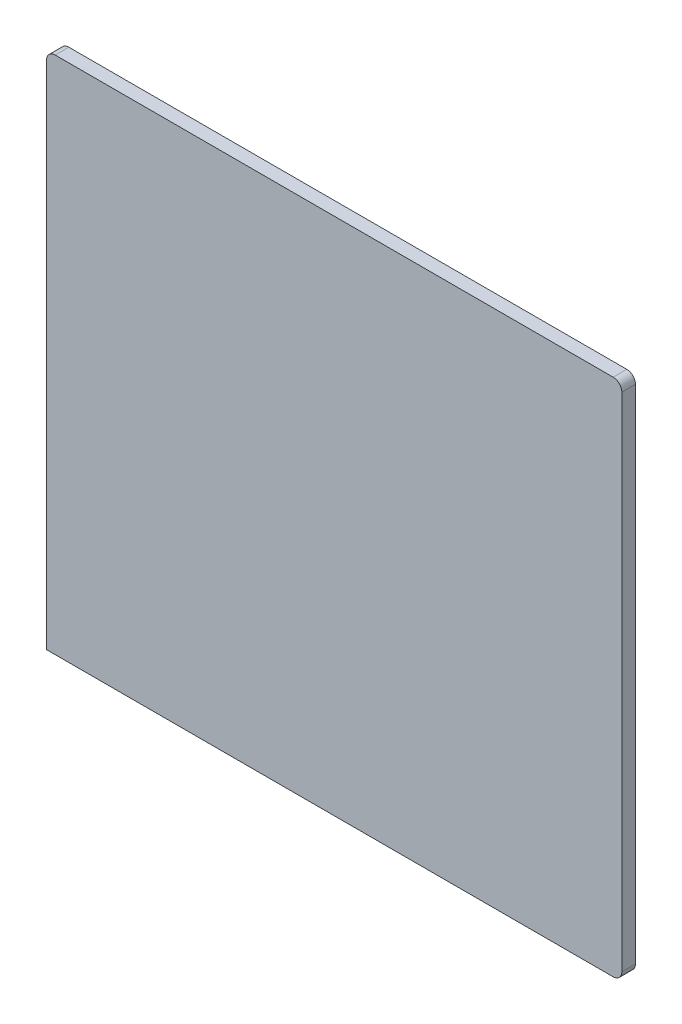
ISO-10303-21;
HEADER;
FILE_DESCRIPTION(('STEP AP214'),'2;1');
FILE_NAME('part.step','',(''),(''),'','','');
FILE_SCHEMA(('AUTOMOTIVE_DESIGN { 1 0 10303 214 1 1 1 1 }'));
ENDSEC;
DATA;
#1=APPLICATION_CONTEXT('core data for automotive mechanical design processes');
#2=APPLICATION_PROTOCOL_DEFINITION('international standard','automotive_design',2000,#1);
#3=PRODUCT_CONTEXT('',#1,'mechanical');
#4=PRODUCT('Part','Part','',(#3));
#5=PRODUCT_RELATED_PRODUCT_CATEGORY('part','',(#4));
#6=PRODUCT_DEFINITION_FORMATION('','',#4);
#7=PRODUCT_DEFINITION_CONTEXT('part definition',#1,'design');
#8=PRODUCT_DEFINITION('design','',#6,#7);
#9=PRODUCT_DEFINITION_SHAPE('','',#8);
#10=(LENGTH_UNIT() NAMED_UNIT(*) SI_UNIT(.MILLI.,.METRE.));
#11=(NAMED_UNIT(*) PLANE_ANGLE_UNIT() SI_UNIT($,.RADIAN.));
#12=(NAMED_UNIT(*) SI_UNIT($,.STERADIAN.) SOLID_ANGLE_UNIT());
#13=UNCERTAINTY_MEASURE_WITH_UNIT(LENGTH_MEASURE(1.E-05),#10,'distance_accuracy_value','');
#14=(GEOMETRIC_REPRESENTATION_CONTEXT(3) GLOBAL_UNCERTAINTY_ASSIGNED_CONTEXT((#13)) GLOBAL_UNIT_ASSIGNED_CONTEXT((#10,
#11,#12)) REPRESENTATION_CONTEXT('',''));
#15=CARTESIAN_POINT('',(0.,0.,0.));
#16=DIRECTION('',(0.,0.,1.));
#17=DIRECTION('',(1.,0.,0.));
#18=AXIS2_PLACEMENT_3D('',#15,#16,#17);
#19=CARTESIAN_POINT('',(49.0729843246072,66.1204329614403,-1.5748));
#20=DIRECTION('',(-1.,0.,0.));
#21=DIRECTION('',(0.,-1.,0.));
#22=AXIS2_PLACEMENT_3D('',#19,#20,#21);
#23=PLANE('',#22);
#24=DIRECTION('',(0.,-1.,0.));
#25=VECTOR('',#24,1.);
#26=CARTESIAN_POINT('',(49.0729843246072,66.1204329614403,0.));
#27=LINE('',#26,#25);
#28=CARTESIAN_POINT('',(49.0729843246072,66.1204329614403,0.));
#29=VERTEX_POINT('',#28);
#30=CARTESIAN_POINT('',(49.0729843246072,7.12043296144033,0.));
#31=VERTEX_POINT('',#30);
#32=EDGE_CURVE('E134',#29,#31,#27,.T.);
#33=ORIENTED_EDGE('',*,*,#32,.F.);
#34=DIRECTION('',(0.,0.,1.));
#35=VECTOR('',#34,1.);
#36=CARTESIAN_POINT('',(49.0729843246072,66.1204329614403,-1.5748));
#37=LINE('',#36,#35);
#38=CARTESIAN_POINT('',(49.0729843246072,66.1204329614403,-1.5748));
#39=VERTEX_POINT('',#38);
#40=EDGE_CURVE('E42',#39,#29,#37,.T.);
#41=ORIENTED_EDGE('',*,*,#40,.F.);
#42=DIRECTION('',(0.,-1.,0.));
#43=VECTOR('',#42,1.);
#44=CARTESIAN_POINT('',(49.0729843246072,66.1204329614403,-1.5748));
#45=LINE('',#44,#43);
#46=CARTESIAN_POINT('',(49.0729843246072,7.12043296144033,-1.5748));
#47=VERTEX_POINT('',#46);
#48=EDGE_CURVE('E111',#39,#47,#45,.T.);
#49=ORIENTED_EDGE('',*,*,#48,.T.);
#50=DIRECTION('',(0.,0.,1.));
#51=VECTOR('',#50,1.);
#52=CARTESIAN_POINT('',(49.0729843246072,7.12043296144033,-1.5748));
#53=LINE('',#52,#51);
#54=EDGE_CURVE('E11',#47,#31,#53,.T.);
#55=ORIENTED_EDGE('',*,*,#54,.T.);
#56=EDGE_LOOP('',(#33,#41,#49,#55));
#57=FACE_BOUND('',#56,.T.);
#58=ADVANCED_FACE('F32',(#57),#23,.T.);
#59=CARTESIAN_POINT('',(50.0729843246072,66.1204329614403,-1.5748));
#60=DIRECTION('',(0.,0.,1.));
#61=DIRECTION('',(1.,0.,0.));
#62=AXIS2_PLACEMENT_3D('',#59,#60,#61);
#63=CYLINDRICAL_SURFACE('',#62,0.999999999999994);
#64=CARTESIAN_POINT('',(50.0729843246072,66.1204329614403,0.));
#65=DIRECTION('',(0.,0.,1.));
#66=DIRECTION('',(1.,0.,0.));
#67=AXIS2_PLACEMENT_3D('',#64,#65,#66);
#68=CIRCLE('',#67,0.999999999999994);
#69=CARTESIAN_POINT('',(50.0729843246072,67.1204329614403,0.));
#70=VERTEX_POINT('',#69);
#71=EDGE_CURVE('E97',#70,#29,#68,.T.);
#72=ORIENTED_EDGE('',*,*,#71,.F.);
#73=DIRECTION('',(0.,0.,1.));
#74=VECTOR('',#73,1.);
#75=CARTESIAN_POINT('',(50.0729843246072,67.1204329614403,-1.5748));
#76=LINE('',#75,#74);
#77=CARTESIAN_POINT('',(50.0729843246072,67.1204329614403,-1.5748));
#78=VERTEX_POINT('',#77);
#79=EDGE_CURVE('E92',#78,#70,#76,.T.);
#80=ORIENTED_EDGE('',*,*,#79,.F.);
#81=CARTESIAN_POINT('',(50.0729843246072,66.1204329614403,-1.5748));
#82=DIRECTION('',(0.,0.,1.));
#83=DIRECTION('',(1.,0.,0.));
#84=AXIS2_PLACEMENT_3D('',#81,#82,#83);
#85=CIRCLE('',#84,0.999999999999994);
#86=EDGE_CURVE('E95',#78,#39,#85,.T.);
#87=ORIENTED_EDGE('',*,*,#86,.T.);
#88=ORIENTED_EDGE('',*,*,#40,.T.);
#89=EDGE_LOOP('',(#72,#80,#87,#88));
#90=FACE_BOUND('',#89,.T.);
#91=ADVANCED_FACE('F94',(#90),#63,.T.);
#92=CARTESIAN_POINT('',(50.0729843246072,67.1204329614403,-1.5748));
#93=DIRECTION('',(0.,1.,0.));
#94=DIRECTION('',(0.,0.,1.));
#95=AXIS2_PLACEMENT_3D('',#92,#93,#94);
#96=PLANE('',#95);
#97=DIRECTION('',(-1.,0.,0.));
#98=VECTOR('',#97,1.);
#99=CARTESIAN_POINT('',(50.0729843246072,67.1204329614403,0.));
#100=LINE('',#99,#98);
#101=CARTESIAN_POINT('',(114.542984324607,67.1204329614403,0.));
#102=VERTEX_POINT('',#101);
#103=EDGE_CURVE('E131',#102,#70,#100,.T.);
#104=ORIENTED_EDGE('',*,*,#103,.F.);
#105=DIRECTION('',(0.,0.,1.));
#106=VECTOR('',#105,1.);
#107=CARTESIAN_POINT('',(114.542984324607,67.1204329614403,-1.5748));
#108=LINE('',#107,#106);
#109=CARTESIAN_POINT('',(114.542984324607,67.1204329614403,-1.5748));
#110=VERTEX_POINT('',#109);
#111=EDGE_CURVE('E102',#110,#102,#108,.T.);
#112=ORIENTED_EDGE('',*,*,#111,.F.);
#113=DIRECTION('',(-1.,0.,0.));
#114=VECTOR('',#113,1.);
#115=CARTESIAN_POINT('',(50.0729843246072,67.1204329614403,-1.5748));
#116=LINE('',#115,#114);
#117=EDGE_CURVE('E108',#110,#78,#116,.T.);
#118=ORIENTED_EDGE('',*,*,#117,.T.);
#119=ORIENTED_EDGE('',*,*,#79,.T.);
#120=EDGE_LOOP('',(#104,#112,#118,#119));
#121=FACE_BOUND('',#120,.T.);
#122=ADVANCED_FACE('F113',(#121),#96,.T.);
#123=CARTESIAN_POINT('',(114.542984324607,66.1204329614403,-1.5748));
#124=DIRECTION('',(0.,0.,1.));
#125=DIRECTION('',(1.,0.,0.));
#126=AXIS2_PLACEMENT_3D('',#123,#124,#125);
#127=CYLINDRICAL_SURFACE('',#126,1.);
#128=CARTESIAN_POINT('',(114.542984324607,66.1204329614403,0.));
#129=DIRECTION('',(0.,0.,1.));
#130=DIRECTION('',(-1.,0.,0.));
#131=AXIS2_PLACEMENT_3D('',#128,#129,#130);
#132=CIRCLE('',#131,1.);
#133=CARTESIAN_POINT('',(115.542984324607,66.1204329614403,0.));
#134=VERTEX_POINT('',#133);
#135=EDGE_CURVE('E128',#134,#102,#132,.T.);
#136=ORIENTED_EDGE('',*,*,#135,.F.);
#137=DIRECTION('',(0.,0.,1.));
#138=VECTOR('',#137,1.);
#139=CARTESIAN_POINT('',(115.542984324607,66.1204329614403,-1.5748));
#140=LINE('',#139,#138);
#141=CARTESIAN_POINT('',(115.542984324607,66.1204329614403,-1.5748));
#142=VERTEX_POINT('',#141);
#143=EDGE_CURVE('E139',#142,#134,#140,.T.);
#144=ORIENTED_EDGE('',*,*,#143,.F.);
#145=CARTESIAN_POINT('',(114.542984324607,66.1204329614403,-1.5748));
#146=DIRECTION('',(0.,0.,1.));
#147=DIRECTION('',(-1.,0.,0.));
#148=AXIS2_PLACEMENT_3D('',#145,#146,#147);
#149=CIRCLE('',#148,1.);
#150=EDGE_CURVE('E114',#142,#110,#149,.T.);
#151=ORIENTED_EDGE('',*,*,#150,.T.);
#152=ORIENTED_EDGE('',*,*,#111,.T.);
#153=EDGE_LOOP('',(#136,#144,#151,#152));
#154=FACE_BOUND('',#153,.T.);
#155=ADVANCED_FACE('F162',(#154),#127,.T.);
#156=CARTESIAN_POINT('',(115.542984324607,66.1204329614403,-1.5748));
#157=DIRECTION('',(1.,0.,0.));
#158=DIRECTION('',(0.,1.,0.));
#159=AXIS2_PLACEMENT_3D('',#156,#157,#158);
#160=PLANE('',#159);
#161=DIRECTION('',(0.,1.,0.));
#162=VECTOR('',#161,1.);
#163=CARTESIAN_POINT('',(115.542984324607,66.1204329614403,0.));
#164=LINE('',#163,#162);
#165=CARTESIAN_POINT('',(115.542984324607,8.12043296144033,0.));
#166=VERTEX_POINT('',#165);
#167=EDGE_CURVE('E125',#166,#134,#164,.T.);
#168=ORIENTED_EDGE('',*,*,#167,.F.);
#169=DIRECTION('',(0.,0.,1.));
#170=VECTOR('',#169,1.);
#171=CARTESIAN_POINT('',(115.542984324607,8.12043296144033,-1.5748));
#172=LINE('',#171,#170);
#173=CARTESIAN_POINT('',(115.542984324607,8.12043296144033,-1.5748));
#174=VERTEX_POINT('',#173);
#175=EDGE_CURVE('E140',#174,#166,#172,.T.);
#176=ORIENTED_EDGE('',*,*,#175,.F.);
#177=DIRECTION('',(0.,1.,0.));
#178=VECTOR('',#177,1.);
#179=CARTESIAN_POINT('',(115.542984324607,66.1204329614403,-1.5748));
#180=LINE('',#179,#178);
#181=EDGE_CURVE('E116',#174,#142,#180,.T.);
#182=ORIENTED_EDGE('',*,*,#181,.T.);
#183=ORIENTED_EDGE('',*,*,#143,.T.);
#184=EDGE_LOOP('',(#168,#176,#182,#183));
#185=FACE_BOUND('',#184,.T.);
#186=ADVANCED_FACE('F165',(#185),#160,.T.);
#187=CARTESIAN_POINT('',(114.542984324607,8.12043296144033,-1.5748));
#188=DIRECTION('',(0.,0.,1.));
#189=DIRECTION('',(1.,0.,0.));
#190=AXIS2_PLACEMENT_3D('',#187,#188,#189);
#191=CYLINDRICAL_SURFACE('',#190,0.999999999999994);
#192=CARTESIAN_POINT('',(114.542984324607,8.12043296144033,0.));
#193=DIRECTION('',(0.,0.,1.));
#194=DIRECTION('',(1.,0.,0.));
#195=AXIS2_PLACEMENT_3D('',#192,#193,#194);
#196=CIRCLE('',#195,0.999999999999994);
#197=CARTESIAN_POINT('',(114.542984324607,7.12043296144033,0.));
#198=VERTEX_POINT('',#197);
#199=EDGE_CURVE('E122',#198,#166,#196,.T.);
#200=ORIENTED_EDGE('',*,*,#199,.F.);
#201=DIRECTION('',(0.,0.,1.));
#202=VECTOR('',#201,1.);
#203=CARTESIAN_POINT('',(114.542984324607,7.12043296144033,-1.5748));
#204=LINE('',#203,#202);
#205=CARTESIAN_POINT('',(114.542984324607,7.12043296144033,-1.5748));
#206=VERTEX_POINT('',#205);
#207=EDGE_CURVE('E36',#206,#198,#204,.T.);
#208=ORIENTED_EDGE('',*,*,#207,.F.);
#209=CARTESIAN_POINT('',(114.542984324607,8.12043296144033,-1.5748));
#210=DIRECTION('',(0.,0.,1.));
#211=DIRECTION('',(1.,0.,0.));
#212=AXIS2_PLACEMENT_3D('',#209,#210,#211);
#213=CIRCLE('',#212,0.999999999999994);
#214=EDGE_CURVE('E234',#206,#174,#213,.T.);
#215=ORIENTED_EDGE('',*,*,#214,.T.);
#216=ORIENTED_EDGE('',*,*,#175,.T.);
#217=EDGE_LOOP('',(#200,#208,#215,#216));
#218=FACE_BOUND('',#217,.T.);
#219=ADVANCED_FACE('F146',(#218),#191,.T.);
#220=CARTESIAN_POINT('',(114.542984324607,7.12043296144033,-1.5748));
#221=DIRECTION('',(0.,-1.,0.));
#222=DIRECTION('',(0.,0.,-1.));
#223=AXIS2_PLACEMENT_3D('',#220,#221,#222);
#224=PLANE('',#223);
#225=DIRECTION('',(1.,0.,0.));
#226=VECTOR('',#225,1.);
#227=CARTESIAN_POINT('',(114.542984324607,7.12043296144033,0.));
#228=LINE('',#227,#226);
#229=EDGE_CURVE('E78',#31,#198,#228,.T.);
#230=ORIENTED_EDGE('',*,*,#229,.F.);
#231=ORIENTED_EDGE('',*,*,#54,.F.);
#232=DIRECTION('',(1.,0.,0.));
#233=VECTOR('',#232,1.);
#234=CARTESIAN_POINT('',(49.0729843246072,7.12043296144033,-1.5748));
#235=LINE('',#234,#233);
#236=EDGE_CURVE('E81',#47,#206,#235,.T.);
#237=ORIENTED_EDGE('',*,*,#236,.T.);
#238=ORIENTED_EDGE('',*,*,#207,.T.);
#239=EDGE_LOOP('',(#230,#231,#237,#238));
#240=FACE_BOUND('',#239,.T.);
#241=ADVANCED_FACE('F34',(#240),#224,.T.);
#242=CARTESIAN_POINT('',(114.542984324607,8.12043296144033,-1.5748));
#243=DIRECTION('',(0.,0.,1.));
#244=DIRECTION('',(1.,0.,0.));
#245=AXIS2_PLACEMENT_3D('',#242,#243,#244);
#246=PLANE('',#245);
#247=ORIENTED_EDGE('',*,*,#236,.F.);
#248=ORIENTED_EDGE('',*,*,#48,.F.);
#249=ORIENTED_EDGE('',*,*,#86,.F.);
#250=ORIENTED_EDGE('',*,*,#117,.F.);
#251=ORIENTED_EDGE('',*,*,#150,.F.);
#252=ORIENTED_EDGE('',*,*,#181,.F.);
#253=ORIENTED_EDGE('',*,*,#214,.F.);
#254=EDGE_LOOP('',(#247,#248,#249,#250,#251,#252,#253));
#255=FACE_BOUND('',#254,.T.);
#256=ADVANCED_FACE('F106',(#255),#246,.F.);
#257=CARTESIAN_POINT('',(114.542984324607,8.12043296144033,0.));
#258=DIRECTION('',(0.,0.,1.));
#259=DIRECTION('',(1.,0.,0.));
#260=AXIS2_PLACEMENT_3D('',#257,#258,#259);
#261=PLANE('',#260);
#262=ORIENTED_EDGE('',*,*,#32,.T.);
#263=ORIENTED_EDGE('',*,*,#229,.T.);
#264=ORIENTED_EDGE('',*,*,#199,.T.);
#265=ORIENTED_EDGE('',*,*,#167,.T.);
#266=ORIENTED_EDGE('',*,*,#135,.T.);
#267=ORIENTED_EDGE('',*,*,#103,.T.);
#268=ORIENTED_EDGE('',*,*,#71,.T.);
#269=EDGE_LOOP('',(#262,#263,#264,#265,#266,#267,#268));
#270=FACE_BOUND('',#269,.T.);
#271=ADVANCED_FACE('F148',(#270),#261,.T.);
#272=CLOSED_SHELL('',(#58,#91,#122,#155,#186,#219,#241,#256,#271));
#273=MANIFOLD_SOLID_BREP('B2',#272);
#274=ADVANCED_BREP_SHAPE_REPRESENTATION('',(#18,#273),#14);
#275=SHAPE_DEFINITION_REPRESENTATION(#9,#274);
ENDSEC;
END-ISO-10303-21;
